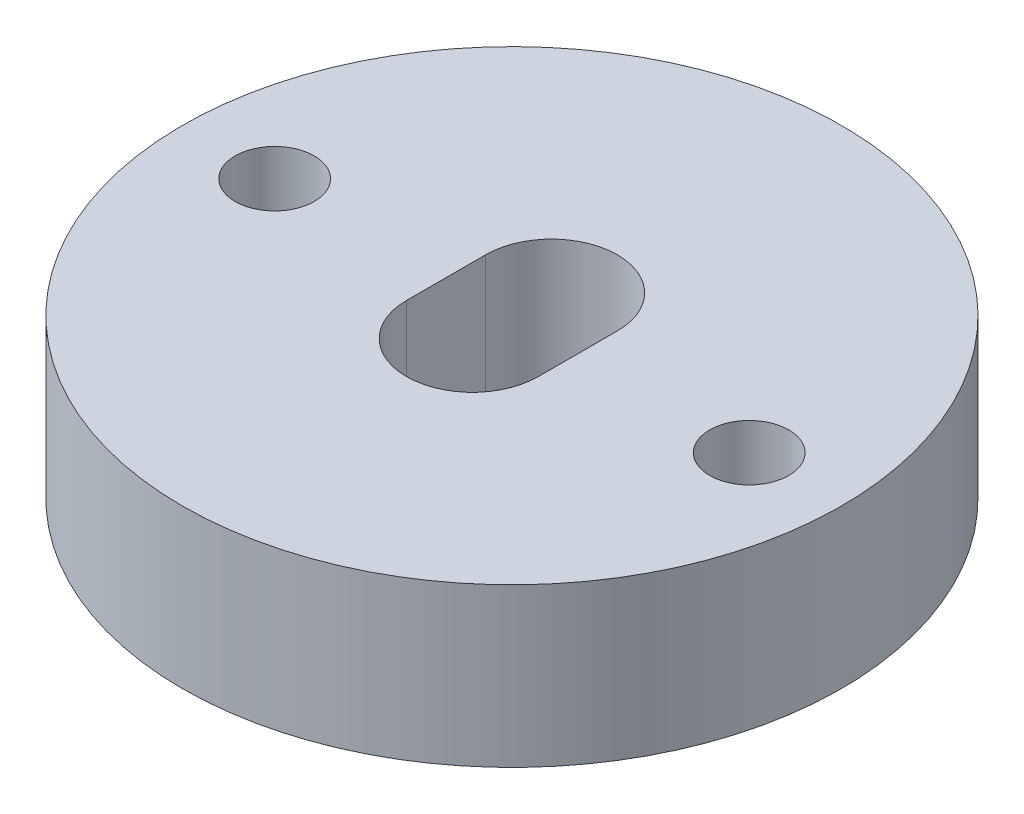
ISO-10303-21;
HEADER;
FILE_DESCRIPTION(('STEP AP214'),'2;1');
FILE_NAME('part.step','',(''),(''),'','','');
FILE_SCHEMA(('AUTOMOTIVE_DESIGN { 1 0 10303 214 1 1 1 1 }'));
ENDSEC;
DATA;
#1=APPLICATION_CONTEXT('core data for automotive mechanical design processes');
#2=APPLICATION_PROTOCOL_DEFINITION('international standard','automotive_design',2000,#1);
#3=PRODUCT_CONTEXT('',#1,'mechanical');
#4=PRODUCT('Part','Part','',(#3));
#5=PRODUCT_RELATED_PRODUCT_CATEGORY('part','',(#4));
#6=PRODUCT_DEFINITION_FORMATION('','',#4);
#7=PRODUCT_DEFINITION_CONTEXT('part definition',#1,'design');
#8=PRODUCT_DEFINITION('design','',#6,#7);
#9=PRODUCT_DEFINITION_SHAPE('','',#8);
#10=(LENGTH_UNIT() NAMED_UNIT(*) SI_UNIT(.MILLI.,.METRE.));
#11=(NAMED_UNIT(*) PLANE_ANGLE_UNIT() SI_UNIT($,.RADIAN.));
#12=(NAMED_UNIT(*) SI_UNIT($,.STERADIAN.) SOLID_ANGLE_UNIT());
#13=UNCERTAINTY_MEASURE_WITH_UNIT(LENGTH_MEASURE(1.E-05),#10,'distance_accuracy_value','');
#14=(GEOMETRIC_REPRESENTATION_CONTEXT(3) GLOBAL_UNCERTAINTY_ASSIGNED_CONTEXT((#13)) GLOBAL_UNIT_ASSIGNED_CONTEXT((#10,
#11,#12)) REPRESENTATION_CONTEXT('',''));
#15=CARTESIAN_POINT('',(0.,0.,0.));
#16=DIRECTION('',(0.,0.,1.));
#17=DIRECTION('',(1.,0.,0.));
#18=AXIS2_PLACEMENT_3D('',#15,#16,#17);
#19=CARTESIAN_POINT('',(0.,6.,0.));
#20=DIRECTION('',(0.,-1.,0.));
#21=DIRECTION('',(0.,0.,-1.));
#22=AXIS2_PLACEMENT_3D('',#19,#20,#21);
#23=CYLINDRICAL_SURFACE('',#22,12.5);
#24=CARTESIAN_POINT('',(0.,6.,0.));
#25=DIRECTION('',(0.,1.,0.));
#26=DIRECTION('',(0.,0.,1.));
#27=AXIS2_PLACEMENT_3D('',#24,#25,#26);
#28=CIRCLE('',#27,12.5);
#29=CARTESIAN_POINT('',(0.,6.,12.5));
#30=VERTEX_POINT('',#29);
#31=EDGE_CURVE('E11',#30,#30,#28,.T.);
#32=ORIENTED_EDGE('',*,*,#31,.F.);
#33=EDGE_LOOP('',(#32));
#34=FACE_BOUND('',#33,.T.);
#35=CARTESIAN_POINT('',(0.,0.,0.));
#36=DIRECTION('',(0.,1.,0.));
#37=DIRECTION('',(0.,0.,1.));
#38=AXIS2_PLACEMENT_3D('',#35,#36,#37);
#39=CIRCLE('',#38,12.5);
#40=CARTESIAN_POINT('',(0.,0.,12.5));
#41=VERTEX_POINT('',#40);
#42=EDGE_CURVE('E42',#41,#41,#39,.T.);
#43=ORIENTED_EDGE('',*,*,#42,.T.);
#44=EDGE_LOOP('',(#43));
#45=FACE_BOUND('',#44,.T.);
#46=ADVANCED_FACE('F39',(#34,#45),#23,.T.);
#47=CARTESIAN_POINT('',(0.,6.,0.));
#48=DIRECTION('',(0.,1.,0.));
#49=DIRECTION('',(0.,0.,1.));
#50=AXIS2_PLACEMENT_3D('',#47,#48,#49);
#51=PLANE('',#50);
#52=CARTESIAN_POINT('',(-9.,6.,0.));
#53=DIRECTION('',(0.,1.,0.));
#54=DIRECTION('',(0.,0.,1.));
#55=AXIS2_PLACEMENT_3D('',#52,#53,#54);
#56=CIRCLE('',#55,1.5);
#57=CARTESIAN_POINT('',(-9.,6.,1.5));
#58=VERTEX_POINT('',#57);
#59=EDGE_CURVE('E188',#58,#58,#56,.T.);
#60=ORIENTED_EDGE('',*,*,#59,.F.);
#61=EDGE_LOOP('',(#60));
#62=FACE_BOUND('',#61,.T.);
#63=CARTESIAN_POINT('',(9.,6.,0.));
#64=DIRECTION('',(0.,1.,0.));
#65=DIRECTION('',(0.,0.,-1.));
#66=AXIS2_PLACEMENT_3D('',#63,#64,#65);
#67=CIRCLE('',#66,1.5);
#68=CARTESIAN_POINT('',(9.,6.,-1.5));
#69=VERTEX_POINT('',#68);
#70=EDGE_CURVE('E108',#69,#69,#67,.T.);
#71=ORIENTED_EDGE('',*,*,#70,.F.);
#72=EDGE_LOOP('',(#71));
#73=FACE_BOUND('',#72,.T.);
#74=CARTESIAN_POINT('',(0.,6.,1.5));
#75=DIRECTION('',(0.,1.,0.));
#76=DIRECTION('',(0.,0.,1.));
#77=AXIS2_PLACEMENT_3D('',#74,#75,#76);
#78=CIRCLE('',#77,2.5);
#79=CARTESIAN_POINT('',(-2.5,6.,1.5));
#80=VERTEX_POINT('',#79);
#81=CARTESIAN_POINT('',(2.5,6.,1.5));
#82=VERTEX_POINT('',#81);
#83=EDGE_CURVE('E54',#80,#82,#78,.T.);
#84=ORIENTED_EDGE('',*,*,#83,.F.);
#85=DIRECTION('',(0.,0.,1.));
#86=VECTOR('',#85,1.);
#87=CARTESIAN_POINT('',(-2.5,6.,1.5));
#88=LINE('',#87,#86);
#89=CARTESIAN_POINT('',(-2.5,6.,-1.5));
#90=VERTEX_POINT('',#89);
#91=EDGE_CURVE('E101',#90,#80,#88,.T.);
#92=ORIENTED_EDGE('',*,*,#91,.F.);
#93=CARTESIAN_POINT('',(0.,6.,-1.5));
#94=DIRECTION('',(0.,1.,0.));
#95=DIRECTION('',(0.,0.,1.));
#96=AXIS2_PLACEMENT_3D('',#93,#94,#95);
#97=CIRCLE('',#96,2.5);
#98=CARTESIAN_POINT('',(2.5,6.,-1.5));
#99=VERTEX_POINT('',#98);
#100=EDGE_CURVE('E105',#99,#90,#97,.T.);
#101=ORIENTED_EDGE('',*,*,#100,.F.);
#102=DIRECTION('',(0.,0.,-1.));
#103=VECTOR('',#102,1.);
#104=CARTESIAN_POINT('',(2.5,6.,1.5));
#105=LINE('',#104,#103);
#106=EDGE_CURVE('E117',#82,#99,#105,.T.);
#107=ORIENTED_EDGE('',*,*,#106,.F.);
#108=EDGE_LOOP('',(#84,#92,#101,#107));
#109=FACE_BOUND('',#108,.T.);
#110=ORIENTED_EDGE('',*,*,#31,.T.);
#111=EDGE_LOOP('',(#110));
#112=FACE_BOUND('',#111,.T.);
#113=ADVANCED_FACE('F135',(#62,#73,#109,#112),#51,.T.);
#114=CARTESIAN_POINT('',(0.,0.,0.));
#115=DIRECTION('',(0.,1.,0.));
#116=DIRECTION('',(0.,0.,1.));
#117=AXIS2_PLACEMENT_3D('',#114,#115,#116);
#118=PLANE('',#117);
#119=CARTESIAN_POINT('',(-9.,0.,0.));
#120=DIRECTION('',(0.,1.,0.));
#121=DIRECTION('',(0.,0.,1.));
#122=AXIS2_PLACEMENT_3D('',#119,#120,#121);
#123=CIRCLE('',#122,1.5);
#124=CARTESIAN_POINT('',(-9.,0.,1.5));
#125=VERTEX_POINT('',#124);
#126=EDGE_CURVE('E118',#125,#125,#123,.T.);
#127=ORIENTED_EDGE('',*,*,#126,.T.);
#128=EDGE_LOOP('',(#127));
#129=FACE_BOUND('',#128,.T.);
#130=CARTESIAN_POINT('',(9.,0.,0.));
#131=DIRECTION('',(0.,1.,0.));
#132=DIRECTION('',(0.,0.,-1.));
#133=AXIS2_PLACEMENT_3D('',#130,#131,#132);
#134=CIRCLE('',#133,1.5);
#135=CARTESIAN_POINT('',(9.,0.,-1.5));
#136=VERTEX_POINT('',#135);
#137=EDGE_CURVE('E182',#136,#136,#134,.T.);
#138=ORIENTED_EDGE('',*,*,#137,.T.);
#139=EDGE_LOOP('',(#138));
#140=FACE_BOUND('',#139,.T.);
#141=DIRECTION('',(0.,0.,1.));
#142=VECTOR('',#141,1.);
#143=CARTESIAN_POINT('',(-2.5,0.,1.5));
#144=LINE('',#143,#142);
#145=CARTESIAN_POINT('',(-2.5,0.,-1.5));
#146=VERTEX_POINT('',#145);
#147=CARTESIAN_POINT('',(-2.5,0.,1.5));
#148=VERTEX_POINT('',#147);
#149=EDGE_CURVE('E89',#146,#148,#144,.T.);
#150=ORIENTED_EDGE('',*,*,#149,.T.);
#151=CARTESIAN_POINT('',(0.,0.,1.5));
#152=DIRECTION('',(0.,1.,0.));
#153=DIRECTION('',(0.,0.,1.));
#154=AXIS2_PLACEMENT_3D('',#151,#152,#153);
#155=CIRCLE('',#154,2.5);
#156=CARTESIAN_POINT('',(2.5,0.,1.5));
#157=VERTEX_POINT('',#156);
#158=EDGE_CURVE('E82',#148,#157,#155,.T.);
#159=ORIENTED_EDGE('',*,*,#158,.T.);
#160=DIRECTION('',(0.,0.,-1.));
#161=VECTOR('',#160,1.);
#162=CARTESIAN_POINT('',(2.5,0.,1.5));
#163=LINE('',#162,#161);
#164=CARTESIAN_POINT('',(2.5,0.,-1.5));
#165=VERTEX_POINT('',#164);
#166=EDGE_CURVE('E92',#157,#165,#163,.T.);
#167=ORIENTED_EDGE('',*,*,#166,.T.);
#168=CARTESIAN_POINT('',(0.,0.,-1.5));
#169=DIRECTION('',(0.,1.,0.));
#170=DIRECTION('',(0.,0.,1.));
#171=AXIS2_PLACEMENT_3D('',#168,#169,#170);
#172=CIRCLE('',#171,2.5);
#173=EDGE_CURVE('E62',#165,#146,#172,.T.);
#174=ORIENTED_EDGE('',*,*,#173,.T.);
#175=EDGE_LOOP('',(#150,#159,#167,#174));
#176=FACE_BOUND('',#175,.T.);
#177=ORIENTED_EDGE('',*,*,#42,.F.);
#178=EDGE_LOOP('',(#177));
#179=FACE_BOUND('',#178,.T.);
#180=ADVANCED_FACE('F97',(#129,#140,#176,#179),#118,.F.);
#181=CARTESIAN_POINT('',(0.,0.,1.5));
#182=DIRECTION('',(0.,1.,0.));
#183=DIRECTION('',(0.,0.,1.));
#184=AXIS2_PLACEMENT_3D('',#181,#182,#183);
#185=CYLINDRICAL_SURFACE('',#184,2.5);
#186=ORIENTED_EDGE('',*,*,#83,.T.);
#187=DIRECTION('',(0.,1.,0.));
#188=VECTOR('',#187,1.);
#189=CARTESIAN_POINT('',(2.5,0.,1.5));
#190=LINE('',#189,#188);
#191=EDGE_CURVE('E78',#157,#82,#190,.T.);
#192=ORIENTED_EDGE('',*,*,#191,.F.);
#193=ORIENTED_EDGE('',*,*,#158,.F.);
#194=DIRECTION('',(0.,1.,0.));
#195=VECTOR('',#194,1.);
#196=CARTESIAN_POINT('',(-2.5,0.,1.5));
#197=LINE('',#196,#195);
#198=EDGE_CURVE('E124',#148,#80,#197,.T.);
#199=ORIENTED_EDGE('',*,*,#198,.T.);
#200=EDGE_LOOP('',(#186,#192,#193,#199));
#201=FACE_BOUND('',#200,.T.);
#202=ADVANCED_FACE('F80',(#201),#185,.F.);
#203=CARTESIAN_POINT('',(-2.5,0.,1.5));
#204=DIRECTION('',(-1.,0.,0.));
#205=DIRECTION('',(0.,0.,1.));
#206=AXIS2_PLACEMENT_3D('',#203,#204,#205);
#207=PLANE('',#206);
#208=ORIENTED_EDGE('',*,*,#91,.T.);
#209=ORIENTED_EDGE('',*,*,#198,.F.);
#210=ORIENTED_EDGE('',*,*,#149,.F.);
#211=DIRECTION('',(0.,1.,0.));
#212=VECTOR('',#211,1.);
#213=CARTESIAN_POINT('',(-2.5,0.,-1.5));
#214=LINE('',#213,#212);
#215=EDGE_CURVE('E127',#146,#90,#214,.T.);
#216=ORIENTED_EDGE('',*,*,#215,.T.);
#217=EDGE_LOOP('',(#208,#209,#210,#216));
#218=FACE_BOUND('',#217,.T.);
#219=ADVANCED_FACE('F138',(#218),#207,.F.);
#220=CARTESIAN_POINT('',(0.,0.,-1.5));
#221=DIRECTION('',(0.,1.,0.));
#222=DIRECTION('',(0.,0.,1.));
#223=AXIS2_PLACEMENT_3D('',#220,#221,#222);
#224=CYLINDRICAL_SURFACE('',#223,2.5);
#225=ORIENTED_EDGE('',*,*,#100,.T.);
#226=ORIENTED_EDGE('',*,*,#215,.F.);
#227=ORIENTED_EDGE('',*,*,#173,.F.);
#228=DIRECTION('',(0.,1.,0.));
#229=VECTOR('',#228,1.);
#230=CARTESIAN_POINT('',(2.5,0.,-1.5));
#231=LINE('',#230,#229);
#232=EDGE_CURVE('E88',#165,#99,#231,.T.);
#233=ORIENTED_EDGE('',*,*,#232,.T.);
#234=EDGE_LOOP('',(#225,#226,#227,#233));
#235=FACE_BOUND('',#234,.T.);
#236=ADVANCED_FACE('F131',(#235),#224,.F.);
#237=CARTESIAN_POINT('',(2.5,0.,1.5));
#238=DIRECTION('',(1.,0.,0.));
#239=DIRECTION('',(0.,0.,-1.));
#240=AXIS2_PLACEMENT_3D('',#237,#238,#239);
#241=PLANE('',#240);
#242=ORIENTED_EDGE('',*,*,#106,.T.);
#243=ORIENTED_EDGE('',*,*,#232,.F.);
#244=ORIENTED_EDGE('',*,*,#166,.F.);
#245=ORIENTED_EDGE('',*,*,#191,.T.);
#246=EDGE_LOOP('',(#242,#243,#244,#245));
#247=FACE_BOUND('',#246,.T.);
#248=ADVANCED_FACE('F93',(#247),#241,.F.);
#249=CARTESIAN_POINT('',(9.,0.,0.));
#250=DIRECTION('',(0.,1.,0.));
#251=DIRECTION('',(0.,0.,1.));
#252=AXIS2_PLACEMENT_3D('',#249,#250,#251);
#253=CYLINDRICAL_SURFACE('',#252,1.5);
#254=ORIENTED_EDGE('',*,*,#137,.F.);
#255=EDGE_LOOP('',(#254));
#256=FACE_BOUND('',#255,.T.);
#257=ORIENTED_EDGE('',*,*,#70,.T.);
#258=EDGE_LOOP('',(#257));
#259=FACE_BOUND('',#258,.T.);
#260=ADVANCED_FACE('F168',(#256,#259),#253,.F.);
#261=CARTESIAN_POINT('',(-9.,0.,0.));
#262=DIRECTION('',(0.,1.,0.));
#263=DIRECTION('',(0.,0.,1.));
#264=AXIS2_PLACEMENT_3D('',#261,#262,#263);
#265=CYLINDRICAL_SURFACE('',#264,1.5);
#266=ORIENTED_EDGE('',*,*,#126,.F.);
#267=EDGE_LOOP('',(#266));
#268=FACE_BOUND('',#267,.T.);
#269=ORIENTED_EDGE('',*,*,#59,.T.);
#270=EDGE_LOOP('',(#269));
#271=FACE_BOUND('',#270,.T.);
#272=ADVANCED_FACE('F172',(#268,#271),#265,.F.);
#273=CLOSED_SHELL('',(#46,#113,#180,#202,#219,#236,#248,#260,#272));
#274=MANIFOLD_SOLID_BREP('B2',#273);
#275=ADVANCED_BREP_SHAPE_REPRESENTATION('',(#18,#274),#14);
#276=SHAPE_DEFINITION_REPRESENTATION(#9,#275);
ENDSEC;
END-ISO-10303-21;
